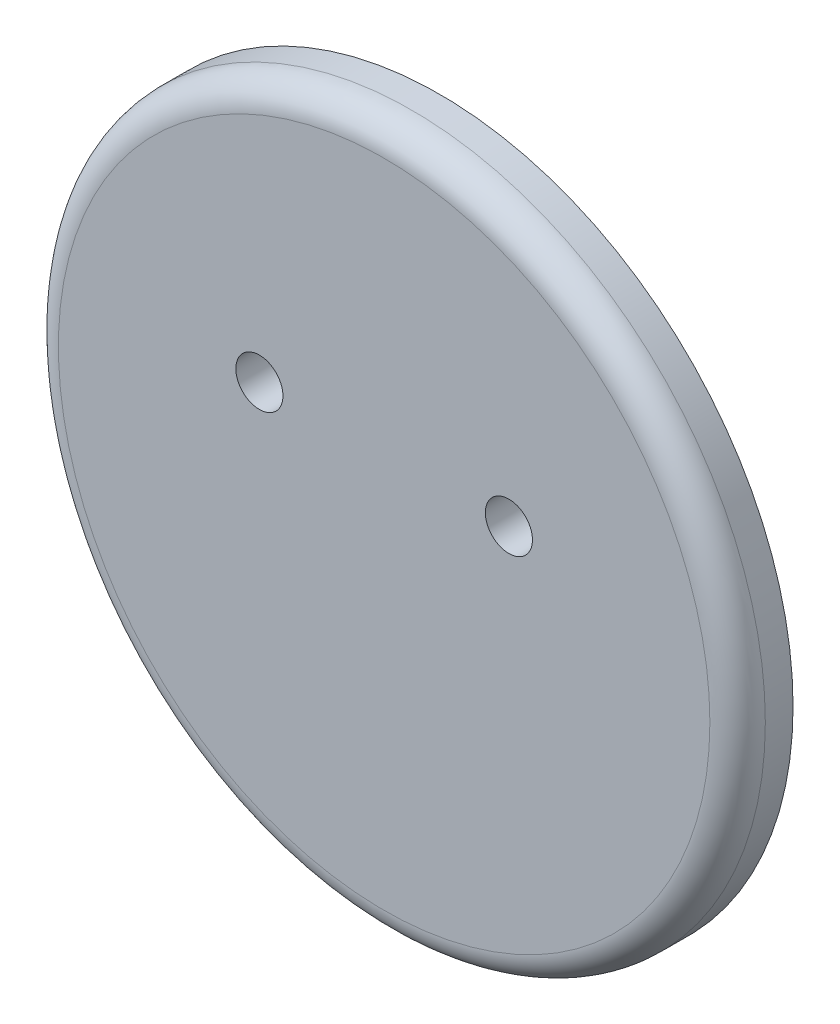
ISO-10303-21;
HEADER;
FILE_DESCRIPTION(('STEP AP214'),'2;1');
FILE_NAME('part.step','',(''),(''),'','','');
FILE_SCHEMA(('AUTOMOTIVE_DESIGN { 1 0 10303 214 1 1 1 1 }'));
ENDSEC;
DATA;
#1=APPLICATION_CONTEXT('core data for automotive mechanical design processes');
#2=APPLICATION_PROTOCOL_DEFINITION('international standard','automotive_design',2000,#1);
#3=PRODUCT_CONTEXT('',#1,'mechanical');
#4=PRODUCT('Part','Part','',(#3));
#5=PRODUCT_RELATED_PRODUCT_CATEGORY('part','',(#4));
#6=PRODUCT_DEFINITION_FORMATION('','',#4);
#7=PRODUCT_DEFINITION_CONTEXT('part definition',#1,'design');
#8=PRODUCT_DEFINITION('design','',#6,#7);
#9=PRODUCT_DEFINITION_SHAPE('','',#8);
#10=(LENGTH_UNIT() NAMED_UNIT(*) SI_UNIT(.MILLI.,.METRE.));
#11=(NAMED_UNIT(*) PLANE_ANGLE_UNIT() SI_UNIT($,.RADIAN.));
#12=(NAMED_UNIT(*) SI_UNIT($,.STERADIAN.) SOLID_ANGLE_UNIT());
#13=UNCERTAINTY_MEASURE_WITH_UNIT(LENGTH_MEASURE(1.E-05),#10,'distance_accuracy_value','');
#14=(GEOMETRIC_REPRESENTATION_CONTEXT(3) GLOBAL_UNCERTAINTY_ASSIGNED_CONTEXT((#13)) GLOBAL_UNIT_ASSIGNED_CONTEXT((#10,
#11,#12)) REPRESENTATION_CONTEXT('',''));
#15=CARTESIAN_POINT('',(0.,0.,0.));
#16=DIRECTION('',(0.,0.,1.));
#17=DIRECTION('',(1.,0.,0.));
#18=AXIS2_PLACEMENT_3D('',#15,#16,#17);
#19=CARTESIAN_POINT('',(0.,0.,4.));
#20=DIRECTION('',(0.,0.,-1.));
#21=DIRECTION('',(-1.,0.,0.));
#22=AXIS2_PLACEMENT_3D('',#19,#20,#21);
#23=CYLINDRICAL_SURFACE('',#22,25.5);
#24=CARTESIAN_POINT('',(0.,0.,2.));
#25=DIRECTION('',(0.,0.,1.));
#26=DIRECTION('',(1.,0.,0.));
#27=AXIS2_PLACEMENT_3D('',#24,#25,#26);
#28=CIRCLE('',#27,25.5);
#29=CARTESIAN_POINT('',(25.5,0.,2.));
#30=VERTEX_POINT('',#29);
#31=EDGE_CURVE('E10',#30,#30,#28,.F.);
#32=ORIENTED_EDGE('',*,*,#31,.T.);
#33=EDGE_LOOP('',(#32));
#34=FACE_BOUND('',#33,.T.);
#35=CARTESIAN_POINT('',(0.,0.,0.));
#36=DIRECTION('',(0.,0.,1.));
#37=DIRECTION('',(1.,0.,0.));
#38=AXIS2_PLACEMENT_3D('',#35,#36,#37);
#39=CIRCLE('',#38,25.5);
#40=CARTESIAN_POINT('',(25.5,0.,0.));
#41=VERTEX_POINT('',#40);
#42=EDGE_CURVE('E58',#41,#41,#39,.T.);
#43=ORIENTED_EDGE('',*,*,#42,.T.);
#44=EDGE_LOOP('',(#43));
#45=FACE_BOUND('',#44,.T.);
#46=ADVANCED_FACE('F32',(#34,#45),#23,.T.);
#47=CARTESIAN_POINT('',(0.,0.,4.));
#48=DIRECTION('',(0.,0.,1.));
#49=DIRECTION('',(1.,0.,0.));
#50=AXIS2_PLACEMENT_3D('',#47,#48,#49);
#51=PLANE('',#50);
#52=CARTESIAN_POINT('',(8.99999999999999,5.,4.));
#53=DIRECTION('',(0.,0.,-1.));
#54=DIRECTION('',(-1.,0.,0.));
#55=AXIS2_PLACEMENT_3D('',#52,#53,#54);
#56=CIRCLE('',#55,1.7);
#57=CARTESIAN_POINT('',(7.29999999999999,5.,4.));
#58=VERTEX_POINT('',#57);
#59=EDGE_CURVE('E67',#58,#58,#56,.T.);
#60=ORIENTED_EDGE('',*,*,#59,.T.);
#61=EDGE_LOOP('',(#60));
#62=FACE_BOUND('',#61,.T.);
#63=CARTESIAN_POINT('',(-9.00000000000001,5.,4.));
#64=DIRECTION('',(0.,0.,-1.));
#65=DIRECTION('',(-1.,0.,0.));
#66=AXIS2_PLACEMENT_3D('',#63,#64,#65);
#67=CIRCLE('',#66,1.7);
#68=CARTESIAN_POINT('',(-10.7,5.,4.));
#69=VERTEX_POINT('',#68);
#70=EDGE_CURVE('E71',#69,#69,#67,.T.);
#71=ORIENTED_EDGE('',*,*,#70,.T.);
#72=EDGE_LOOP('',(#71));
#73=FACE_BOUND('',#72,.T.);
#74=CARTESIAN_POINT('',(0.,0.,4.));
#75=DIRECTION('',(0.,0.,1.));
#76=DIRECTION('',(1.,0.,0.));
#77=AXIS2_PLACEMENT_3D('',#74,#75,#76);
#78=CIRCLE('',#77,23.5);
#79=CARTESIAN_POINT('',(23.5,0.,4.));
#80=VERTEX_POINT('',#79);
#81=EDGE_CURVE('E39',#80,#80,#78,.T.);
#82=ORIENTED_EDGE('',*,*,#81,.T.);
#83=EDGE_LOOP('',(#82));
#84=FACE_BOUND('',#83,.T.);
#85=ADVANCED_FACE('F80',(#62,#73,#84),#51,.T.);
#86=CARTESIAN_POINT('',(0.,0.,0.));
#87=DIRECTION('',(0.,0.,1.));
#88=DIRECTION('',(1.,0.,0.));
#89=AXIS2_PLACEMENT_3D('',#86,#87,#88);
#90=PLANE('',#89);
#91=CARTESIAN_POINT('',(0.,0.,0.));
#92=DIRECTION('',(0.,0.,-1.));
#93=DIRECTION('',(-1.,0.,0.));
#94=AXIS2_PLACEMENT_3D('',#91,#92,#93);
#95=CIRCLE('',#94,24.5);
#96=CARTESIAN_POINT('',(-24.5,0.,0.));
#97=VERTEX_POINT('',#96);
#98=EDGE_CURVE('E61',#97,#97,#95,.T.);
#99=ORIENTED_EDGE('',*,*,#98,.F.);
#100=EDGE_LOOP('',(#99));
#101=FACE_BOUND('',#100,.T.);
#102=ORIENTED_EDGE('',*,*,#42,.F.);
#103=EDGE_LOOP('',(#102));
#104=FACE_BOUND('',#103,.T.);
#105=ADVANCED_FACE('F96',(#101,#104),#90,.F.);
#106=CARTESIAN_POINT('',(0.,0.,1.675));
#107=DIRECTION('',(0.,0.,-1.));
#108=DIRECTION('',(-1.,0.,0.));
#109=AXIS2_PLACEMENT_3D('',#106,#107,#108);
#110=CYLINDRICAL_SURFACE('',#109,24.5);
#111=CARTESIAN_POINT('',(0.,0.,0.175));
#112=DIRECTION('',(0.,0.,-1.));
#113=DIRECTION('',(-1.,0.,0.));
#114=AXIS2_PLACEMENT_3D('',#111,#112,#113);
#115=CIRCLE('',#114,24.5);
#116=CARTESIAN_POINT('',(-24.5,0.,0.175));
#117=VERTEX_POINT('',#116);
#118=EDGE_CURVE('E43',#117,#117,#115,.F.);
#119=ORIENTED_EDGE('',*,*,#118,.T.);
#120=EDGE_LOOP('',(#119));
#121=FACE_BOUND('',#120,.T.);
#122=ORIENTED_EDGE('',*,*,#98,.T.);
#123=EDGE_LOOP('',(#122));
#124=FACE_BOUND('',#123,.T.);
#125=ADVANCED_FACE('F108',(#121,#124),#110,.F.);
#126=CARTESIAN_POINT('',(0.,0.,1.675));
#127=DIRECTION('',(0.,0.,-1.));
#128=DIRECTION('',(-1.,0.,0.));
#129=AXIS2_PLACEMENT_3D('',#126,#127,#128);
#130=PLANE('',#129);
#131=CARTESIAN_POINT('',(0.,0.,1.675));
#132=DIRECTION('',(0.,0.,-1.));
#133=DIRECTION('',(-1.,0.,0.));
#134=AXIS2_PLACEMENT_3D('',#131,#132,#133);
#135=CIRCLE('',#134,20.);
#136=CARTESIAN_POINT('',(-20.,0.,1.675));
#137=VERTEX_POINT('',#136);
#138=EDGE_CURVE('E47',#137,#137,#135,.F.);
#139=ORIENTED_EDGE('',*,*,#138,.T.);
#140=EDGE_LOOP('',(#139));
#141=FACE_BOUND('',#140,.T.);
#142=CARTESIAN_POINT('',(0.,0.,1.675));
#143=DIRECTION('',(0.,0.,-1.));
#144=DIRECTION('',(-1.,0.,0.));
#145=AXIS2_PLACEMENT_3D('',#142,#143,#144);
#146=CIRCLE('',#145,23.);
#147=CARTESIAN_POINT('',(-23.,0.,1.675));
#148=VERTEX_POINT('',#147);
#149=EDGE_CURVE('E52',#148,#148,#146,.T.);
#150=ORIENTED_EDGE('',*,*,#149,.T.);
#151=EDGE_LOOP('',(#150));
#152=FACE_BOUND('',#151,.T.);
#153=ADVANCED_FACE('F102',(#141,#152),#130,.T.);
#154=CARTESIAN_POINT('',(0.,0.,1.675));
#155=DIRECTION('',(0.,0.,-1.));
#156=DIRECTION('',(-1.,0.,0.));
#157=AXIS2_PLACEMENT_3D('',#154,#155,#156);
#158=CYLINDRICAL_SURFACE('',#157,18.5);
#159=CARTESIAN_POINT('',(0.,0.,0.175));
#160=DIRECTION('',(0.,0.,-1.));
#161=DIRECTION('',(-1.,0.,0.));
#162=AXIS2_PLACEMENT_3D('',#159,#160,#161);
#163=CIRCLE('',#162,18.5);
#164=CARTESIAN_POINT('',(-18.5,0.,0.175));
#165=VERTEX_POINT('',#164);
#166=EDGE_CURVE('E55',#165,#165,#163,.T.);
#167=ORIENTED_EDGE('',*,*,#166,.T.);
#168=EDGE_LOOP('',(#167));
#169=FACE_BOUND('',#168,.T.);
#170=CARTESIAN_POINT('',(0.,0.,0.));
#171=DIRECTION('',(0.,0.,-1.));
#172=DIRECTION('',(-1.,0.,0.));
#173=AXIS2_PLACEMENT_3D('',#170,#171,#172);
#174=CIRCLE('',#173,18.5);
#175=CARTESIAN_POINT('',(-18.5,0.,0.));
#176=VERTEX_POINT('',#175);
#177=EDGE_CURVE('E64',#176,#176,#174,.T.);
#178=ORIENTED_EDGE('',*,*,#177,.F.);
#179=EDGE_LOOP('',(#178));
#180=FACE_BOUND('',#179,.T.);
#181=ADVANCED_FACE('F94',(#169,#180),#158,.T.);
#182=CARTESIAN_POINT('',(8.99999999999999,5.,0.));
#183=DIRECTION('',(0.,0.,-1.));
#184=DIRECTION('',(-1.,0.,0.));
#185=AXIS2_PLACEMENT_3D('',#182,#183,#184);
#186=CIRCLE('',#185,1.7);
#187=CARTESIAN_POINT('',(7.29999999999999,5.,0.));
#188=VERTEX_POINT('',#187);
#189=EDGE_CURVE('E74',#188,#188,#186,.T.);
#190=ORIENTED_EDGE('',*,*,#189,.F.);
#191=EDGE_LOOP('',(#190));
#192=FACE_BOUND('',#191,.T.);
#193=CARTESIAN_POINT('',(-9.00000000000001,5.,0.));
#194=DIRECTION('',(0.,0.,-1.));
#195=DIRECTION('',(-1.,0.,0.));
#196=AXIS2_PLACEMENT_3D('',#193,#194,#195);
#197=CIRCLE('',#196,1.7);
#198=CARTESIAN_POINT('',(-10.7,5.,0.));
#199=VERTEX_POINT('',#198);
#200=EDGE_CURVE('E68',#199,#199,#197,.T.);
#201=ORIENTED_EDGE('',*,*,#200,.F.);
#202=EDGE_LOOP('',(#201));
#203=FACE_BOUND('',#202,.T.);
#204=ORIENTED_EDGE('',*,*,#177,.T.);
#205=EDGE_LOOP('',(#204));
#206=FACE_BOUND('',#205,.T.);
#207=ADVANCED_FACE('F90',(#192,#203,#206),#90,.F.);
#208=CARTESIAN_POINT('',(0.,0.,0.175));
#209=DIRECTION('',(0.,0.,-1.));
#210=DIRECTION('',(-1.,0.,0.));
#211=AXIS2_PLACEMENT_3D('',#208,#209,#210);
#212=TOROIDAL_SURFACE('',#211,20.,1.5);
#213=ORIENTED_EDGE('',*,*,#138,.F.);
#214=EDGE_LOOP('',(#213));
#215=FACE_BOUND('',#214,.T.);
#216=ORIENTED_EDGE('',*,*,#166,.F.);
#217=EDGE_LOOP('',(#216));
#218=FACE_BOUND('',#217,.T.);
#219=ADVANCED_FACE('F93',(#215,#218),#212,.F.);
#220=CARTESIAN_POINT('',(0.,0.,0.175));
#221=DIRECTION('',(0.,0.,-1.));
#222=DIRECTION('',(-1.,0.,0.));
#223=AXIS2_PLACEMENT_3D('',#220,#221,#222);
#224=TOROIDAL_SURFACE('',#223,23.,1.5);
#225=ORIENTED_EDGE('',*,*,#118,.F.);
#226=EDGE_LOOP('',(#225));
#227=FACE_BOUND('',#226,.T.);
#228=ORIENTED_EDGE('',*,*,#149,.F.);
#229=EDGE_LOOP('',(#228));
#230=FACE_BOUND('',#229,.T.);
#231=ADVANCED_FACE('F121',(#227,#230),#224,.F.);
#232=CARTESIAN_POINT('',(0.,0.,2.));
#233=DIRECTION('',(0.,0.,1.));
#234=DIRECTION('',(1.,0.,0.));
#235=AXIS2_PLACEMENT_3D('',#232,#233,#234);
#236=TOROIDAL_SURFACE('',#235,23.5,2.);
#237=ORIENTED_EDGE('',*,*,#31,.F.);
#238=EDGE_LOOP('',(#237));
#239=FACE_BOUND('',#238,.T.);
#240=ORIENTED_EDGE('',*,*,#81,.F.);
#241=EDGE_LOOP('',(#240));
#242=FACE_BOUND('',#241,.T.);
#243=ADVANCED_FACE('F34',(#239,#242),#236,.T.);
#244=CARTESIAN_POINT('',(-9.00000000000001,5.,4.));
#245=DIRECTION('',(0.,0.,-1.));
#246=DIRECTION('',(-1.,0.,0.));
#247=AXIS2_PLACEMENT_3D('',#244,#245,#246);
#248=CYLINDRICAL_SURFACE('',#247,1.7);
#249=ORIENTED_EDGE('',*,*,#70,.F.);
#250=EDGE_LOOP('',(#249));
#251=FACE_BOUND('',#250,.T.);
#252=ORIENTED_EDGE('',*,*,#200,.T.);
#253=EDGE_LOOP('',(#252));
#254=FACE_BOUND('',#253,.T.);
#255=ADVANCED_FACE('F86',(#251,#254),#248,.F.);
#256=CARTESIAN_POINT('',(8.99999999999999,5.,4.));
#257=DIRECTION('',(0.,0.,-1.));
#258=DIRECTION('',(-1.,0.,0.));
#259=AXIS2_PLACEMENT_3D('',#256,#257,#258);
#260=CYLINDRICAL_SURFACE('',#259,1.7);
#261=ORIENTED_EDGE('',*,*,#59,.F.);
#262=EDGE_LOOP('',(#261));
#263=FACE_BOUND('',#262,.T.);
#264=ORIENTED_EDGE('',*,*,#189,.T.);
#265=EDGE_LOOP('',(#264));
#266=FACE_BOUND('',#265,.T.);
#267=ADVANCED_FACE('F83',(#263,#266),#260,.F.);
#268=CLOSED_SHELL('',(#46,#85,#105,#125,#153,#181,#207,#219,#231,#243,#255,#267));
#269=MANIFOLD_SOLID_BREP('B2',#268);
#270=ADVANCED_BREP_SHAPE_REPRESENTATION('',(#18,#269),#14);
#271=SHAPE_DEFINITION_REPRESENTATION(#9,#270);
ENDSEC;
END-ISO-10303-21;
